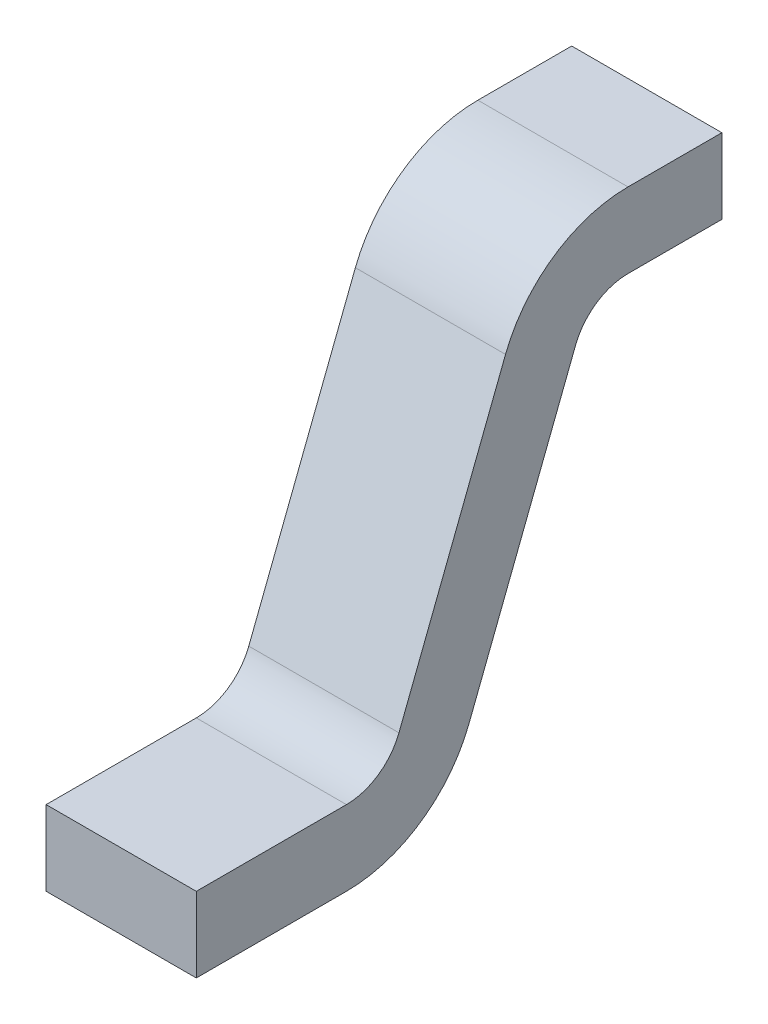
ISO-10303-21;
HEADER;
FILE_DESCRIPTION(('STEP AP214'),'2;1');
FILE_NAME('part.step','',(''),(''),'','','');
FILE_SCHEMA(('AUTOMOTIVE_DESIGN { 1 0 10303 214 1 1 1 1 }'));
ENDSEC;
DATA;
#1=APPLICATION_CONTEXT('core data for automotive mechanical design processes');
#2=APPLICATION_PROTOCOL_DEFINITION('international standard','automotive_design',2000,#1);
#3=PRODUCT_CONTEXT('',#1,'mechanical');
#4=PRODUCT('Part','Part','',(#3));
#5=PRODUCT_RELATED_PRODUCT_CATEGORY('part','',(#4));
#6=PRODUCT_DEFINITION_FORMATION('','',#4);
#7=PRODUCT_DEFINITION_CONTEXT('part definition',#1,'design');
#8=PRODUCT_DEFINITION('design','',#6,#7);
#9=PRODUCT_DEFINITION_SHAPE('','',#8);
#10=(LENGTH_UNIT() NAMED_UNIT(*) SI_UNIT(.MILLI.,.METRE.));
#11=(NAMED_UNIT(*) PLANE_ANGLE_UNIT() SI_UNIT($,.RADIAN.));
#12=(NAMED_UNIT(*) SI_UNIT($,.STERADIAN.) SOLID_ANGLE_UNIT());
#13=UNCERTAINTY_MEASURE_WITH_UNIT(LENGTH_MEASURE(1.E-05),#10,'distance_accuracy_value','');
#14=(GEOMETRIC_REPRESENTATION_CONTEXT(3) GLOBAL_UNCERTAINTY_ASSIGNED_CONTEXT((#13)) GLOBAL_UNIT_ASSIGNED_CONTEXT((#10,
#11,#12)) REPRESENTATION_CONTEXT('',''));
#15=CARTESIAN_POINT('',(0.,0.,0.));
#16=DIRECTION('',(0.,0.,1.));
#17=DIRECTION('',(1.,0.,0.));
#18=AXIS2_PLACEMENT_3D('',#15,#16,#17);
#19=CARTESIAN_POINT('',(0.2,-0.25,0.25));
#20=DIRECTION('',(1.,0.,0.));
#21=DIRECTION('',(0.,0.,-1.));
#22=AXIS2_PLACEMENT_3D('',#19,#20,#21);
#23=PLANE('',#22);
#24=DIRECTION('',(0.,0.,-1.));
#25=VECTOR('',#24,1.);
#26=CARTESIAN_POINT('',(0.2,-1.15,1.4));
#27=LINE('',#26,#25);
#28=CARTESIAN_POINT('',(0.2,-1.15,1.));
#29=VERTEX_POINT('',#28);
#30=CARTESIAN_POINT('',(0.2,-1.15,1.4));
#31=VERTEX_POINT('',#30);
#32=EDGE_CURVE('E147',#29,#31,#27,.F.);
#33=ORIENTED_EDGE('',*,*,#32,.F.);
#34=CARTESIAN_POINT('',(0.2,-0.8,1.));
#35=DIRECTION('',(1.,0.,0.));
#36=DIRECTION('',(0.,0.,-1.));
#37=AXIS2_PLACEMENT_3D('',#34,#35,#36);
#38=CIRCLE('',#37,0.35);
#39=CARTESIAN_POINT('',(0.2,-0.926713966740117,0.673743091056956));
#40=VERTEX_POINT('',#39);
#41=EDGE_CURVE('E189',#40,#29,#38,.F.);
#42=ORIENTED_EDGE('',*,*,#41,.F.);
#43=DIRECTION('',(0.,0.932162596979705,-0.362039904971885));
#44=VECTOR('',#43,1.);
#45=CARTESIAN_POINT('',(0.2,-0.195694014254,0.389824389547));
#46=LINE('',#45,#44);
#47=CARTESIAN_POINT('',(0.2,-0.195694014254109,0.389824389546978));
#48=VERTEX_POINT('',#47);
#49=EDGE_CURVE('E139',#48,#40,#46,.F.);
#50=ORIENTED_EDGE('',*,*,#49,.F.);
#51=CARTESIAN_POINT('',(0.2,-0.25,0.25));
#52=DIRECTION('',(1.,0.,0.));
#53=DIRECTION('',(0.,0.,-1.));
#54=AXIS2_PLACEMENT_3D('',#51,#52,#53);
#55=CIRCLE('',#54,0.15);
#56=CARTESIAN_POINT('',(0.2,-0.1,0.25));
#57=VERTEX_POINT('',#56);
#58=EDGE_CURVE('E128',#48,#57,#55,.F.);
#59=ORIENTED_EDGE('',*,*,#58,.T.);
#60=DIRECTION('',(0.,0.,-1.));
#61=VECTOR('',#60,1.);
#62=CARTESIAN_POINT('',(0.2,-0.1,0.25));
#63=LINE('',#62,#61);
#64=CARTESIAN_POINT('',(0.2,-0.1,0.));
#65=VERTEX_POINT('',#64);
#66=EDGE_CURVE('E136',#65,#57,#63,.F.);
#67=ORIENTED_EDGE('',*,*,#66,.F.);
#68=DIRECTION('',(0.,1.,0.));
#69=VECTOR('',#68,1.);
#70=CARTESIAN_POINT('',(0.2,0.1,0.));
#71=LINE('',#70,#69);
#72=CARTESIAN_POINT('',(0.2,0.1,0.));
#73=VERTEX_POINT('',#72);
#74=EDGE_CURVE('E96',#65,#73,#71,.T.);
#75=ORIENTED_EDGE('',*,*,#74,.T.);
#76=DIRECTION('',(0.,0.,-1.));
#77=VECTOR('',#76,1.);
#78=CARTESIAN_POINT('',(0.2,0.1,0.25));
#79=LINE('',#78,#77);
#80=CARTESIAN_POINT('',(0.2,0.1,0.25));
#81=VERTEX_POINT('',#80);
#82=EDGE_CURVE('E92',#73,#81,#79,.F.);
#83=ORIENTED_EDGE('',*,*,#82,.T.);
#84=CARTESIAN_POINT('',(0.2,-0.25,0.25));
#85=DIRECTION('',(1.,0.,0.));
#86=DIRECTION('',(0.,0.,-1.));
#87=AXIS2_PLACEMENT_3D('',#84,#85,#86);
#88=CIRCLE('',#87,0.35);
#89=CARTESIAN_POINT('',(0.2,-0.123286033259913,0.576256908942966));
#90=VERTEX_POINT('',#89);
#91=EDGE_CURVE('E20',#90,#81,#88,.F.);
#92=ORIENTED_EDGE('',*,*,#91,.F.);
#93=DIRECTION('',(0.,0.932162596979705,-0.362039904971885));
#94=VECTOR('',#93,1.);
#95=CARTESIAN_POINT('',(0.2,-0.12328603326,0.576256908943));
#96=LINE('',#95,#94);
#97=CARTESIAN_POINT('',(0.2,-0.854305985745907,0.860175610452983));
#98=VERTEX_POINT('',#97);
#99=EDGE_CURVE('E166',#90,#98,#96,.F.);
#100=ORIENTED_EDGE('',*,*,#99,.T.);
#101=CARTESIAN_POINT('',(0.2,-0.8,1.));
#102=DIRECTION('',(1.,0.,0.));
#103=DIRECTION('',(0.,0.,-1.));
#104=AXIS2_PLACEMENT_3D('',#101,#102,#103);
#105=CIRCLE('',#104,0.15);
#106=CARTESIAN_POINT('',(0.2,-0.95,1.));
#107=VERTEX_POINT('',#106);
#108=EDGE_CURVE('E191',#98,#107,#105,.F.);
#109=ORIENTED_EDGE('',*,*,#108,.T.);
#110=DIRECTION('',(0.,0.,-1.));
#111=VECTOR('',#110,1.);
#112=CARTESIAN_POINT('',(0.2,-0.95,1.4));
#113=LINE('',#112,#111);
#114=CARTESIAN_POINT('',(0.2,-0.95,1.4));
#115=VERTEX_POINT('',#114);
#116=EDGE_CURVE('E160',#107,#115,#113,.F.);
#117=ORIENTED_EDGE('',*,*,#116,.T.);
#118=DIRECTION('',(0.,1.,0.));
#119=VECTOR('',#118,1.);
#120=CARTESIAN_POINT('',(0.2,-1.15,1.4));
#121=LINE('',#120,#119);
#122=EDGE_CURVE('E154',#115,#31,#121,.F.);
#123=ORIENTED_EDGE('',*,*,#122,.T.);
#124=EDGE_LOOP('',(#33,#42,#50,#59,#67,#75,#83,#92,#100,#109,#117,#123));
#125=FACE_BOUND('',#124,.T.);
#126=ADVANCED_FACE('F17',(#125),#23,.T.);
#127=CARTESIAN_POINT('',(-0.2,-0.1,0.25));
#128=DIRECTION('',(0.,-1.,0.));
#129=DIRECTION('',(0.,0.,-1.));
#130=AXIS2_PLACEMENT_3D('',#127,#128,#129);
#131=PLANE('',#130);
#132=DIRECTION('',(1.,0.,0.));
#133=VECTOR('',#132,1.);
#134=CARTESIAN_POINT('',(-0.2,-0.1,0.));
#135=LINE('',#134,#133);
#136=CARTESIAN_POINT('',(-0.2,-0.1,0.));
#137=VERTEX_POINT('',#136);
#138=EDGE_CURVE('E103',#137,#65,#135,.T.);
#139=ORIENTED_EDGE('',*,*,#138,.T.);
#140=ORIENTED_EDGE('',*,*,#66,.T.);
#141=DIRECTION('',(1.,0.,0.));
#142=VECTOR('',#141,1.);
#143=CARTESIAN_POINT('',(-0.2,-0.1,0.25));
#144=LINE('',#143,#142);
#145=CARTESIAN_POINT('',(-0.2,-0.1,0.25));
#146=VERTEX_POINT('',#145);
#147=EDGE_CURVE('E142',#57,#146,#144,.F.);
#148=ORIENTED_EDGE('',*,*,#147,.T.);
#149=DIRECTION('',(0.,0.,-1.));
#150=VECTOR('',#149,1.);
#151=CARTESIAN_POINT('',(-0.2,-0.1,0.25));
#152=LINE('',#151,#150);
#153=EDGE_CURVE('E126',#146,#137,#152,.T.);
#154=ORIENTED_EDGE('',*,*,#153,.T.);
#155=EDGE_LOOP('',(#139,#140,#148,#154));
#156=FACE_BOUND('',#155,.T.);
#157=ADVANCED_FACE('F265',(#156),#131,.T.);
#158=CARTESIAN_POINT('',(-0.2,0.1,0.));
#159=DIRECTION('',(0.,0.,1.));
#160=DIRECTION('',(1.,0.,0.));
#161=AXIS2_PLACEMENT_3D('',#158,#159,#160);
#162=PLANE('',#161);
#163=ORIENTED_EDGE('',*,*,#138,.F.);
#164=DIRECTION('',(0.,1.,0.));
#165=VECTOR('',#164,1.);
#166=CARTESIAN_POINT('',(-0.2,-0.25,0.));
#167=LINE('',#166,#165);
#168=CARTESIAN_POINT('',(-0.2,0.1,0.));
#169=VERTEX_POINT('',#168);
#170=EDGE_CURVE('E119',#137,#169,#167,.T.);
#171=ORIENTED_EDGE('',*,*,#170,.T.);
#172=DIRECTION('',(1.,0.,0.));
#173=VECTOR('',#172,1.);
#174=CARTESIAN_POINT('',(-0.2,0.1,0.));
#175=LINE('',#174,#173);
#176=EDGE_CURVE('E109',#169,#73,#175,.T.);
#177=ORIENTED_EDGE('',*,*,#176,.T.);
#178=ORIENTED_EDGE('',*,*,#74,.F.);
#179=EDGE_LOOP('',(#163,#171,#177,#178));
#180=FACE_BOUND('',#179,.T.);
#181=ADVANCED_FACE('F125',(#180),#162,.F.);
#182=CARTESIAN_POINT('',(-0.2,0.1,0.25));
#183=DIRECTION('',(0.,-1.,0.));
#184=DIRECTION('',(0.,0.,-1.));
#185=AXIS2_PLACEMENT_3D('',#182,#183,#184);
#186=PLANE('',#185);
#187=ORIENTED_EDGE('',*,*,#176,.F.);
#188=DIRECTION('',(0.,0.,-1.));
#189=VECTOR('',#188,1.);
#190=CARTESIAN_POINT('',(-0.2,0.1,0.25));
#191=LINE('',#190,#189);
#192=CARTESIAN_POINT('',(-0.2,0.1,0.25));
#193=VERTEX_POINT('',#192);
#194=EDGE_CURVE('E113',#169,#193,#191,.F.);
#195=ORIENTED_EDGE('',*,*,#194,.T.);
#196=DIRECTION('',(1.,0.,0.));
#197=VECTOR('',#196,1.);
#198=CARTESIAN_POINT('',(-0.2,0.1,0.25));
#199=LINE('',#198,#197);
#200=EDGE_CURVE('E171',#81,#193,#199,.F.);
#201=ORIENTED_EDGE('',*,*,#200,.F.);
#202=ORIENTED_EDGE('',*,*,#82,.F.);
#203=EDGE_LOOP('',(#187,#195,#201,#202));
#204=FACE_BOUND('',#203,.T.);
#205=ADVANCED_FACE('F111',(#204),#186,.F.);
#206=CARTESIAN_POINT('',(-0.2,-0.25,0.25));
#207=DIRECTION('',(1.,0.,0.));
#208=DIRECTION('',(0.,0.,-1.));
#209=AXIS2_PLACEMENT_3D('',#206,#207,#208);
#210=CYLINDRICAL_SURFACE('',#209,0.35);
#211=DIRECTION('',(1.,0.,0.));
#212=VECTOR('',#211,1.);
#213=CARTESIAN_POINT('',(-0.2,-0.12328603326,0.576256908943));
#214=LINE('',#213,#212);
#215=CARTESIAN_POINT('',(-0.2,-0.123286033259896,0.57625690894296));
#216=VERTEX_POINT('',#215);
#217=EDGE_CURVE('E169',#216,#90,#214,.T.);
#218=ORIENTED_EDGE('',*,*,#217,.T.);
#219=ORIENTED_EDGE('',*,*,#91,.T.);
#220=ORIENTED_EDGE('',*,*,#200,.T.);
#221=CARTESIAN_POINT('',(-0.2,-0.25,0.25));
#222=DIRECTION('',(1.,0.,0.));
#223=DIRECTION('',(0.,0.,-1.));
#224=AXIS2_PLACEMENT_3D('',#221,#222,#223);
#225=CIRCLE('',#224,0.35);
#226=EDGE_CURVE('E123',#193,#216,#225,.T.);
#227=ORIENTED_EDGE('',*,*,#226,.T.);
#228=EDGE_LOOP('',(#218,#219,#220,#227));
#229=FACE_BOUND('',#228,.T.);
#230=ADVANCED_FACE('F205',(#229),#210,.T.);
#231=CARTESIAN_POINT('',(-0.2,-0.12328603326,0.576256908943));
#232=DIRECTION('',(0.,-0.362039904971885,-0.932162596979705));
#233=DIRECTION('',(0.,0.932162596979705,-0.362039904971885));
#234=AXIS2_PLACEMENT_3D('',#231,#232,#233);
#235=PLANE('',#234);
#236=ORIENTED_EDGE('',*,*,#217,.F.);
#237=DIRECTION('',(0.,-0.932162596979667,0.362039904971985));
#238=VECTOR('',#237,1.);
#239=CARTESIAN_POINT('',(-0.2,-0.12328603326,0.576256908943));
#240=LINE('',#239,#238);
#241=CARTESIAN_POINT('',(-0.2,-0.854305985745899,0.860175610453025));
#242=VERTEX_POINT('',#241);
#243=EDGE_CURVE('E185',#216,#242,#240,.T.);
#244=ORIENTED_EDGE('',*,*,#243,.T.);
#245=DIRECTION('',(1.,0.,0.));
#246=VECTOR('',#245,1.);
#247=CARTESIAN_POINT('',(-0.2,-0.854305985745957,0.860175610453112));
#248=LINE('',#247,#246);
#249=EDGE_CURVE('E168',#242,#98,#248,.T.);
#250=ORIENTED_EDGE('',*,*,#249,.T.);
#251=ORIENTED_EDGE('',*,*,#99,.F.);
#252=EDGE_LOOP('',(#236,#244,#250,#251));
#253=FACE_BOUND('',#252,.T.);
#254=ADVANCED_FACE('F206',(#253),#235,.F.);
#255=CARTESIAN_POINT('',(-0.2,-0.8,1.));
#256=DIRECTION('',(1.,0.,0.));
#257=DIRECTION('',(0.,0.,-1.));
#258=AXIS2_PLACEMENT_3D('',#255,#256,#257);
#259=CYLINDRICAL_SURFACE('',#258,0.15);
#260=ORIENTED_EDGE('',*,*,#249,.F.);
#261=CARTESIAN_POINT('',(-0.2,-0.8,1.));
#262=DIRECTION('',(1.,0.,0.));
#263=DIRECTION('',(0.,0.,-1.));
#264=AXIS2_PLACEMENT_3D('',#261,#262,#263);
#265=CIRCLE('',#264,0.15);
#266=CARTESIAN_POINT('',(-0.2,-0.95,1.));
#267=VERTEX_POINT('',#266);
#268=EDGE_CURVE('E181',#242,#267,#265,.F.);
#269=ORIENTED_EDGE('',*,*,#268,.T.);
#270=DIRECTION('',(1.,0.,0.));
#271=VECTOR('',#270,1.);
#272=CARTESIAN_POINT('',(-0.2,-0.95,1.));
#273=LINE('',#272,#271);
#274=EDGE_CURVE('E163',#267,#107,#273,.T.);
#275=ORIENTED_EDGE('',*,*,#274,.T.);
#276=ORIENTED_EDGE('',*,*,#108,.F.);
#277=EDGE_LOOP('',(#260,#269,#275,#276));
#278=FACE_BOUND('',#277,.T.);
#279=ADVANCED_FACE('F290',(#278),#259,.F.);
#280=CARTESIAN_POINT('',(-0.2,-0.95,1.4));
#281=DIRECTION('',(0.,-1.,0.));
#282=DIRECTION('',(0.,0.,-1.));
#283=AXIS2_PLACEMENT_3D('',#280,#281,#282);
#284=PLANE('',#283);
#285=ORIENTED_EDGE('',*,*,#274,.F.);
#286=DIRECTION('',(0.,0.,-1.));
#287=VECTOR('',#286,1.);
#288=CARTESIAN_POINT('',(-0.2,-0.95,0.25));
#289=LINE('',#288,#287);
#290=CARTESIAN_POINT('',(-0.2,-0.95,1.4));
#291=VERTEX_POINT('',#290);
#292=EDGE_CURVE('E184',#267,#291,#289,.F.);
#293=ORIENTED_EDGE('',*,*,#292,.T.);
#294=DIRECTION('',(-1.,0.,0.));
#295=VECTOR('',#294,1.);
#296=CARTESIAN_POINT('',(-0.2,-0.95,1.4));
#297=LINE('',#296,#295);
#298=EDGE_CURVE('E157',#291,#115,#297,.F.);
#299=ORIENTED_EDGE('',*,*,#298,.T.);
#300=ORIENTED_EDGE('',*,*,#116,.F.);
#301=EDGE_LOOP('',(#285,#293,#299,#300));
#302=FACE_BOUND('',#301,.T.);
#303=ADVANCED_FACE('F237',(#302),#284,.F.);
#304=CARTESIAN_POINT('',(-0.2,-1.15,1.4));
#305=DIRECTION('',(0.,0.,-1.));
#306=DIRECTION('',(-1.,0.,0.));
#307=AXIS2_PLACEMENT_3D('',#304,#305,#306);
#308=PLANE('',#307);
#309=ORIENTED_EDGE('',*,*,#298,.F.);
#310=DIRECTION('',(0.,1.,0.));
#311=VECTOR('',#310,1.);
#312=CARTESIAN_POINT('',(-0.2,-0.25,1.4));
#313=LINE('',#312,#311);
#314=CARTESIAN_POINT('',(-0.2,-1.15,1.4));
#315=VERTEX_POINT('',#314);
#316=EDGE_CURVE('E227',#291,#315,#313,.F.);
#317=ORIENTED_EDGE('',*,*,#316,.T.);
#318=DIRECTION('',(1.,0.,0.));
#319=VECTOR('',#318,1.);
#320=CARTESIAN_POINT('',(-0.2,-1.15,1.4));
#321=LINE('',#320,#319);
#322=EDGE_CURVE('E151',#31,#315,#321,.F.);
#323=ORIENTED_EDGE('',*,*,#322,.F.);
#324=ORIENTED_EDGE('',*,*,#122,.F.);
#325=EDGE_LOOP('',(#309,#317,#323,#324));
#326=FACE_BOUND('',#325,.T.);
#327=ADVANCED_FACE('F241',(#326),#308,.F.);
#328=CARTESIAN_POINT('',(-0.2,-1.15,1.4));
#329=DIRECTION('',(0.,-1.,0.));
#330=DIRECTION('',(0.,0.,-1.));
#331=AXIS2_PLACEMENT_3D('',#328,#329,#330);
#332=PLANE('',#331);
#333=DIRECTION('',(1.,0.,0.));
#334=VECTOR('',#333,1.);
#335=CARTESIAN_POINT('',(-0.2,-1.15,1.));
#336=LINE('',#335,#334);
#337=CARTESIAN_POINT('',(-0.2,-1.15,1.));
#338=VERTEX_POINT('',#337);
#339=EDGE_CURVE('E150',#29,#338,#336,.F.);
#340=ORIENTED_EDGE('',*,*,#339,.F.);
#341=ORIENTED_EDGE('',*,*,#32,.T.);
#342=ORIENTED_EDGE('',*,*,#322,.T.);
#343=DIRECTION('',(0.,0.,-1.));
#344=VECTOR('',#343,1.);
#345=CARTESIAN_POINT('',(-0.2,-1.15,0.25));
#346=LINE('',#345,#344);
#347=EDGE_CURVE('E180',#315,#338,#346,.T.);
#348=ORIENTED_EDGE('',*,*,#347,.T.);
#349=EDGE_LOOP('',(#340,#341,#342,#348));
#350=FACE_BOUND('',#349,.T.);
#351=ADVANCED_FACE('F260',(#350),#332,.T.);
#352=CARTESIAN_POINT('',(-0.2,-0.8,1.));
#353=DIRECTION('',(1.,0.,0.));
#354=DIRECTION('',(0.,0.,-1.));
#355=AXIS2_PLACEMENT_3D('',#352,#353,#354);
#356=CYLINDRICAL_SURFACE('',#355,0.35);
#357=DIRECTION('',(1.,0.,0.));
#358=VECTOR('',#357,1.);
#359=CARTESIAN_POINT('',(-0.2,-0.92671396674003,0.673743091056922));
#360=LINE('',#359,#358);
#361=CARTESIAN_POINT('',(-0.2,-0.926713966740119,0.673743091057002));
#362=VERTEX_POINT('',#361);
#363=EDGE_CURVE('E143',#40,#362,#360,.F.);
#364=ORIENTED_EDGE('',*,*,#363,.F.);
#365=ORIENTED_EDGE('',*,*,#41,.T.);
#366=ORIENTED_EDGE('',*,*,#339,.T.);
#367=CARTESIAN_POINT('',(-0.2,-0.8,1.));
#368=DIRECTION('',(1.,0.,0.));
#369=DIRECTION('',(0.,0.,-1.));
#370=AXIS2_PLACEMENT_3D('',#367,#368,#369);
#371=CIRCLE('',#370,0.35);
#372=EDGE_CURVE('E177',#338,#362,#371,.T.);
#373=ORIENTED_EDGE('',*,*,#372,.T.);
#374=EDGE_LOOP('',(#364,#365,#366,#373));
#375=FACE_BOUND('',#374,.T.);
#376=ADVANCED_FACE('F259',(#375),#356,.T.);
#377=CARTESIAN_POINT('',(-0.2,-0.195694014254,0.389824389547));
#378=DIRECTION('',(0.,-0.362039904971885,-0.932162596979705));
#379=DIRECTION('',(0.,0.932162596979705,-0.362039904971885));
#380=AXIS2_PLACEMENT_3D('',#377,#378,#379);
#381=PLANE('',#380);
#382=DIRECTION('',(1.,0.,0.));
#383=VECTOR('',#382,1.);
#384=CARTESIAN_POINT('',(-0.2,-0.195694014254043,0.389824389546888));
#385=LINE('',#384,#383);
#386=CARTESIAN_POINT('',(-0.2,-0.195694014254101,0.389824389546975));
#387=VERTEX_POINT('',#386);
#388=EDGE_CURVE('E34',#387,#48,#385,.T.);
#389=ORIENTED_EDGE('',*,*,#388,.T.);
#390=ORIENTED_EDGE('',*,*,#49,.T.);
#391=ORIENTED_EDGE('',*,*,#363,.T.);
#392=DIRECTION('',(0.,0.932162596979666,-0.362039904971985));
#393=VECTOR('',#392,1.);
#394=CARTESIAN_POINT('',(-0.2,-0.92671396674,0.673743091057));
#395=LINE('',#394,#393);
#396=EDGE_CURVE('E26',#362,#387,#395,.T.);
#397=ORIENTED_EDGE('',*,*,#396,.T.);
#398=EDGE_LOOP('',(#389,#390,#391,#397));
#399=FACE_BOUND('',#398,.T.);
#400=ADVANCED_FACE('F256',(#399),#381,.T.);
#401=CARTESIAN_POINT('',(-0.2,-0.25,0.25));
#402=DIRECTION('',(1.,0.,0.));
#403=DIRECTION('',(0.,0.,-1.));
#404=AXIS2_PLACEMENT_3D('',#401,#402,#403);
#405=CYLINDRICAL_SURFACE('',#404,0.15);
#406=ORIENTED_EDGE('',*,*,#388,.F.);
#407=CARTESIAN_POINT('',(-0.2,-0.25,0.25));
#408=DIRECTION('',(1.,0.,0.));
#409=DIRECTION('',(0.,0.,-1.));
#410=AXIS2_PLACEMENT_3D('',#407,#408,#409);
#411=CIRCLE('',#410,0.15);
#412=EDGE_CURVE('E11',#387,#146,#411,.F.);
#413=ORIENTED_EDGE('',*,*,#412,.T.);
#414=ORIENTED_EDGE('',*,*,#147,.F.);
#415=ORIENTED_EDGE('',*,*,#58,.F.);
#416=EDGE_LOOP('',(#406,#413,#414,#415));
#417=FACE_BOUND('',#416,.T.);
#418=ADVANCED_FACE('F263',(#417),#405,.F.);
#419=CARTESIAN_POINT('',(-0.2,-0.25,0.25));
#420=DIRECTION('',(1.,0.,0.));
#421=DIRECTION('',(0.,0.,-1.));
#422=AXIS2_PLACEMENT_3D('',#419,#420,#421);
#423=PLANE('',#422);
#424=ORIENTED_EDGE('',*,*,#396,.F.);
#425=ORIENTED_EDGE('',*,*,#372,.F.);
#426=ORIENTED_EDGE('',*,*,#347,.F.);
#427=ORIENTED_EDGE('',*,*,#316,.F.);
#428=ORIENTED_EDGE('',*,*,#292,.F.);
#429=ORIENTED_EDGE('',*,*,#268,.F.);
#430=ORIENTED_EDGE('',*,*,#243,.F.);
#431=ORIENTED_EDGE('',*,*,#226,.F.);
#432=ORIENTED_EDGE('',*,*,#194,.F.);
#433=ORIENTED_EDGE('',*,*,#170,.F.);
#434=ORIENTED_EDGE('',*,*,#153,.F.);
#435=ORIENTED_EDGE('',*,*,#412,.F.);
#436=EDGE_LOOP('',(#424,#425,#426,#427,#428,#429,#430,#431,#432,#433,#434,#435));
#437=FACE_BOUND('',#436,.T.);
#438=ADVANCED_FACE('F118',(#437),#423,.F.);
#439=CLOSED_SHELL('',(#126,#157,#181,#205,#230,#254,#279,#303,#327,#351,#376,#400,#418,#438));
#440=MANIFOLD_SOLID_BREP('B1',#439);
#441=ADVANCED_BREP_SHAPE_REPRESENTATION('',(#18,#440),#14);
#442=SHAPE_DEFINITION_REPRESENTATION(#9,#441);
ENDSEC;
END-ISO-10303-21;
